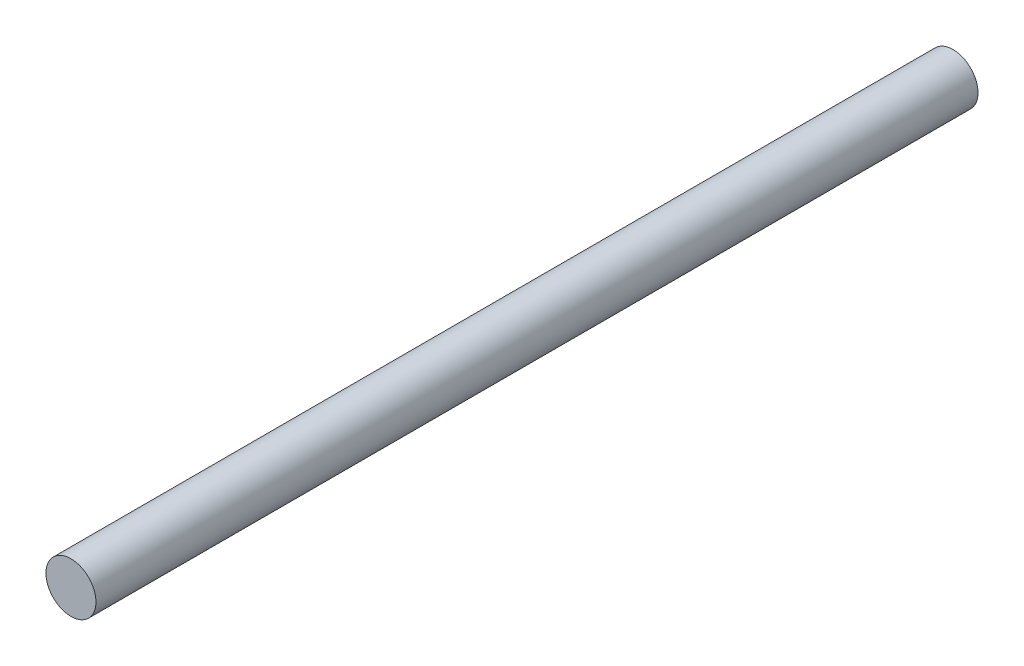
ISO-10303-21;
HEADER;
FILE_DESCRIPTION(('STEP AP214'),'2;1');
FILE_NAME('part.step','',(''),(''),'','','');
FILE_SCHEMA(('AUTOMOTIVE_DESIGN { 1 0 10303 214 1 1 1 1 }'));
ENDSEC;
DATA;
#1=APPLICATION_CONTEXT('core data for automotive mechanical design processes');
#2=APPLICATION_PROTOCOL_DEFINITION('international standard','automotive_design',2000,#1);
#3=PRODUCT_CONTEXT('',#1,'mechanical');
#4=PRODUCT('Part','Part','',(#3));
#5=PRODUCT_RELATED_PRODUCT_CATEGORY('part','',(#4));
#6=PRODUCT_DEFINITION_FORMATION('','',#4);
#7=PRODUCT_DEFINITION_CONTEXT('part definition',#1,'design');
#8=PRODUCT_DEFINITION('design','',#6,#7);
#9=PRODUCT_DEFINITION_SHAPE('','',#8);
#10=(LENGTH_UNIT() NAMED_UNIT(*) SI_UNIT(.MILLI.,.METRE.));
#11=(NAMED_UNIT(*) PLANE_ANGLE_UNIT() SI_UNIT($,.RADIAN.));
#12=(NAMED_UNIT(*) SI_UNIT($,.STERADIAN.) SOLID_ANGLE_UNIT());
#13=UNCERTAINTY_MEASURE_WITH_UNIT(LENGTH_MEASURE(1.E-05),#10,'distance_accuracy_value','');
#14=(GEOMETRIC_REPRESENTATION_CONTEXT(3) GLOBAL_UNCERTAINTY_ASSIGNED_CONTEXT((#13)) GLOBAL_UNIT_ASSIGNED_CONTEXT((#10,
#11,#12)) REPRESENTATION_CONTEXT('',''));
#15=CARTESIAN_POINT('',(0.,0.,0.));
#16=DIRECTION('',(0.,0.,1.));
#17=DIRECTION('',(1.,0.,0.));
#18=AXIS2_PLACEMENT_3D('',#15,#16,#17);
#19=CARTESIAN_POINT('',(0.,0.,88.2));
#20=DIRECTION('',(0.,0.,1.));
#21=DIRECTION('',(1.,0.,0.));
#22=AXIS2_PLACEMENT_3D('',#19,#20,#21);
#23=PLANE('',#22);
#24=CARTESIAN_POINT('',(0.,0.,88.2));
#25=DIRECTION('',(0.,0.,1.));
#26=DIRECTION('',(1.,0.,0.));
#27=AXIS2_PLACEMENT_3D('',#24,#25,#26);
#28=CIRCLE('',#27,2.5);
#29=CARTESIAN_POINT('',(2.5,0.,88.2));
#30=VERTEX_POINT('',#29);
#31=EDGE_CURVE('E10',#30,#30,#28,.T.);
#32=ORIENTED_EDGE('',*,*,#31,.T.);
#33=EDGE_LOOP('',(#32));
#34=FACE_BOUND('',#33,.T.);
#35=ADVANCED_FACE('F38',(#34),#23,.T.);
#36=CARTESIAN_POINT('',(0.,0.,88.2));
#37=DIRECTION('',(0.,0.,-1.));
#38=DIRECTION('',(-1.,0.,0.));
#39=AXIS2_PLACEMENT_3D('',#36,#37,#38);
#40=CYLINDRICAL_SURFACE('',#39,2.5);
#41=ORIENTED_EDGE('',*,*,#31,.F.);
#42=EDGE_LOOP('',(#41));
#43=FACE_BOUND('',#42,.T.);
#44=CARTESIAN_POINT('',(0.,0.,0.));
#45=DIRECTION('',(0.,0.,1.));
#46=DIRECTION('',(1.,0.,0.));
#47=AXIS2_PLACEMENT_3D('',#44,#45,#46);
#48=CIRCLE('',#47,2.5);
#49=CARTESIAN_POINT('',(2.5,0.,0.));
#50=VERTEX_POINT('',#49);
#51=EDGE_CURVE('E42',#50,#50,#48,.T.);
#52=ORIENTED_EDGE('',*,*,#51,.T.);
#53=EDGE_LOOP('',(#52));
#54=FACE_BOUND('',#53,.T.);
#55=ADVANCED_FACE('F40',(#43,#54),#40,.T.);
#56=CARTESIAN_POINT('',(0.,0.,0.));
#57=DIRECTION('',(0.,0.,1.));
#58=DIRECTION('',(1.,0.,0.));
#59=AXIS2_PLACEMENT_3D('',#56,#57,#58);
#60=PLANE('',#59);
#61=ORIENTED_EDGE('',*,*,#51,.F.);
#62=EDGE_LOOP('',(#61));
#63=FACE_BOUND('',#62,.T.);
#64=ADVANCED_FACE('F52',(#63),#60,.F.);
#65=CLOSED_SHELL('',(#35,#55,#64));
#66=MANIFOLD_SOLID_BREP('B2',#65);
#67=ADVANCED_BREP_SHAPE_REPRESENTATION('',(#18,#66),#14);
#68=SHAPE_DEFINITION_REPRESENTATION(#9,#67);
ENDSEC;
END-ISO-10303-21;
